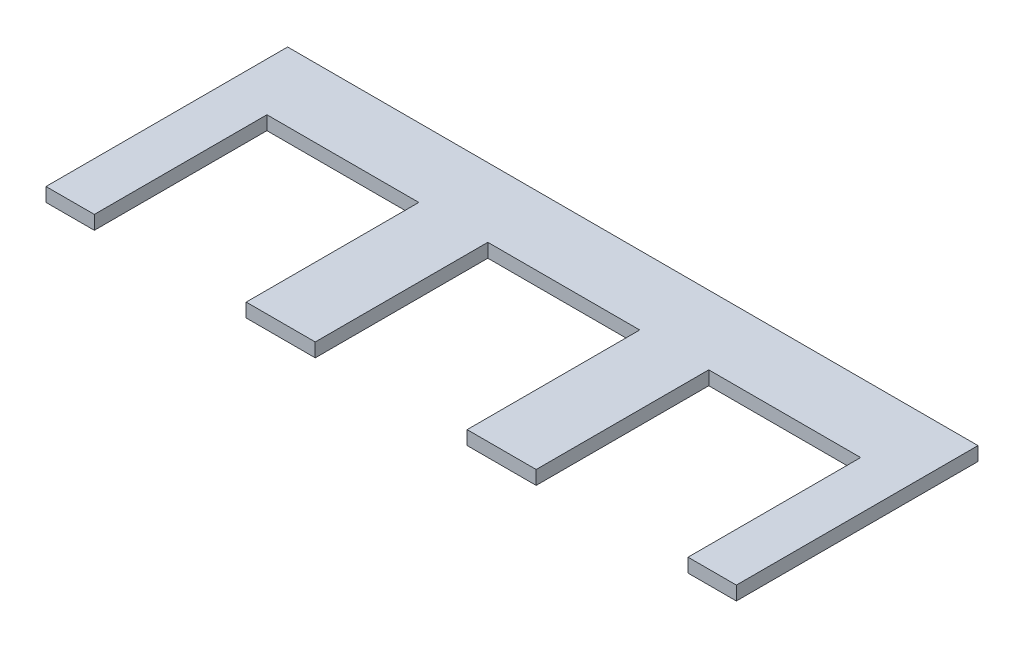
ISO-10303-21;
HEADER;
FILE_DESCRIPTION(('STEP AP214'),'2;1');
FILE_NAME('part.step','',(''),(''),'','','');
FILE_SCHEMA(('AUTOMOTIVE_DESIGN { 1 0 10303 214 1 1 1 1 }'));
ENDSEC;
DATA;
#1=APPLICATION_CONTEXT('core data for automotive mechanical design processes');
#2=APPLICATION_PROTOCOL_DEFINITION('international standard','automotive_design',2000,#1);
#3=PRODUCT_CONTEXT('',#1,'mechanical');
#4=PRODUCT('Part','Part','',(#3));
#5=PRODUCT_RELATED_PRODUCT_CATEGORY('part','',(#4));
#6=PRODUCT_DEFINITION_FORMATION('','',#4);
#7=PRODUCT_DEFINITION_CONTEXT('part definition',#1,'design');
#8=PRODUCT_DEFINITION('design','',#6,#7);
#9=PRODUCT_DEFINITION_SHAPE('','',#8);
#10=(LENGTH_UNIT() NAMED_UNIT(*) SI_UNIT(.MILLI.,.METRE.));
#11=(NAMED_UNIT(*) PLANE_ANGLE_UNIT() SI_UNIT($,.RADIAN.));
#12=(NAMED_UNIT(*) SI_UNIT($,.STERADIAN.) SOLID_ANGLE_UNIT());
#13=UNCERTAINTY_MEASURE_WITH_UNIT(LENGTH_MEASURE(1.E-05),#10,'distance_accuracy_value','');
#14=(GEOMETRIC_REPRESENTATION_CONTEXT(3) GLOBAL_UNCERTAINTY_ASSIGNED_CONTEXT((#13)) GLOBAL_UNIT_ASSIGNED_CONTEXT((#10,
#11,#12)) REPRESENTATION_CONTEXT('',''));
#15=CARTESIAN_POINT('',(0.,0.,0.));
#16=DIRECTION('',(0.,0.,1.));
#17=DIRECTION('',(1.,0.,0.));
#18=AXIS2_PLACEMENT_3D('',#15,#16,#17);
#19=CARTESIAN_POINT('',(-500.,20.,175.));
#20=DIRECTION('',(0.,0.,-1.));
#21=DIRECTION('',(-1.,0.,0.));
#22=AXIS2_PLACEMENT_3D('',#19,#20,#21);
#23=PLANE('',#22);
#24=DIRECTION('',(1.,0.,0.));
#25=VECTOR('',#24,1.);
#26=CARTESIAN_POINT('',(-500.,0.,175.));
#27=LINE('',#26,#25);
#28=CARTESIAN_POINT('',(110.,0.,175.));
#29=VERTEX_POINT('',#28);
#30=CARTESIAN_POINT('',(210.,0.,175.));
#31=VERTEX_POINT('',#30);
#32=EDGE_CURVE('E189',#29,#31,#27,.T.);
#33=ORIENTED_EDGE('',*,*,#32,.T.);
#34=DIRECTION('',(0.,1.,0.));
#35=VECTOR('',#34,1.);
#36=CARTESIAN_POINT('',(210.,0.,175.));
#37=LINE('',#36,#35);
#38=CARTESIAN_POINT('',(210.,20.,175.));
#39=VERTEX_POINT('',#38);
#40=EDGE_CURVE('E246',#31,#39,#37,.T.);
#41=ORIENTED_EDGE('',*,*,#40,.T.);
#42=DIRECTION('',(1.,0.,0.));
#43=VECTOR('',#42,1.);
#44=CARTESIAN_POINT('',(-500.,20.,175.));
#45=LINE('',#44,#43);
#46=CARTESIAN_POINT('',(110.,20.,175.));
#47=VERTEX_POINT('',#46);
#48=EDGE_CURVE('E283',#47,#39,#45,.T.);
#49=ORIENTED_EDGE('',*,*,#48,.F.);
#50=DIRECTION('',(0.,1.,0.));
#51=VECTOR('',#50,1.);
#52=CARTESIAN_POINT('',(110.,0.,175.));
#53=LINE('',#52,#51);
#54=EDGE_CURVE('E216',#29,#47,#53,.T.);
#55=ORIENTED_EDGE('',*,*,#54,.F.);
#56=EDGE_LOOP('',(#33,#41,#49,#55));
#57=FACE_BOUND('',#56,.T.);
#58=ADVANCED_FACE('F39',(#57),#23,.F.);
#59=CARTESIAN_POINT('',(-500.,0.,175.));
#60=VERTEX_POINT('',#59);
#61=CARTESIAN_POINT('',(-430.,0.,175.));
#62=VERTEX_POINT('',#61);
#63=EDGE_CURVE('E166',#60,#62,#27,.T.);
#64=ORIENTED_EDGE('',*,*,#63,.T.);
#65=DIRECTION('',(0.,1.,0.));
#66=VECTOR('',#65,1.);
#67=CARTESIAN_POINT('',(-430.,0.,175.));
#68=LINE('',#67,#66);
#69=CARTESIAN_POINT('',(-430.,20.,175.));
#70=VERTEX_POINT('',#69);
#71=EDGE_CURVE('E155',#62,#70,#68,.T.);
#72=ORIENTED_EDGE('',*,*,#71,.T.);
#73=CARTESIAN_POINT('',(-500.,20.,175.));
#74=VERTEX_POINT('',#73);
#75=EDGE_CURVE('E202',#74,#70,#45,.T.);
#76=ORIENTED_EDGE('',*,*,#75,.F.);
#77=DIRECTION('',(0.,-1.,0.));
#78=VECTOR('',#77,1.);
#79=CARTESIAN_POINT('',(-500.,20.,175.));
#80=LINE('',#79,#78);
#81=EDGE_CURVE('E180',#74,#60,#80,.T.);
#82=ORIENTED_EDGE('',*,*,#81,.T.);
#83=EDGE_LOOP('',(#64,#72,#76,#82));
#84=FACE_BOUND('',#83,.T.);
#85=ADVANCED_FACE('F172',(#84),#23,.F.);
#86=CARTESIAN_POINT('',(-210.,20.,175.));
#87=VERTEX_POINT('',#86);
#88=CARTESIAN_POINT('',(-110.,20.,175.));
#89=VERTEX_POINT('',#88);
#90=EDGE_CURVE('E208',#87,#89,#45,.T.);
#91=ORIENTED_EDGE('',*,*,#90,.F.);
#92=DIRECTION('',(0.,1.,0.));
#93=VECTOR('',#92,1.);
#94=CARTESIAN_POINT('',(-210.,0.,175.));
#95=LINE('',#94,#93);
#96=CARTESIAN_POINT('',(-210.,0.,175.));
#97=VERTEX_POINT('',#96);
#98=EDGE_CURVE('E165',#97,#87,#95,.T.);
#99=ORIENTED_EDGE('',*,*,#98,.F.);
#100=CARTESIAN_POINT('',(-110.,0.,175.));
#101=VERTEX_POINT('',#100);
#102=EDGE_CURVE('E177',#97,#101,#27,.T.);
#103=ORIENTED_EDGE('',*,*,#102,.T.);
#104=DIRECTION('',(0.,1.,0.));
#105=VECTOR('',#104,1.);
#106=CARTESIAN_POINT('',(-110.,0.,175.));
#107=LINE('',#106,#105);
#108=EDGE_CURVE('E213',#101,#89,#107,.T.);
#109=ORIENTED_EDGE('',*,*,#108,.T.);
#110=EDGE_LOOP('',(#91,#99,#103,#109));
#111=FACE_BOUND('',#110,.T.);
#112=ADVANCED_FACE('F278',(#111),#23,.F.);
#113=CARTESIAN_POINT('',(500.,20.,175.));
#114=DIRECTION('',(-1.,0.,0.));
#115=DIRECTION('',(0.,0.,1.));
#116=AXIS2_PLACEMENT_3D('',#113,#114,#115);
#117=PLANE('',#116);
#118=DIRECTION('',(0.,0.,-1.));
#119=VECTOR('',#118,1.);
#120=CARTESIAN_POINT('',(500.,0.,175.));
#121=LINE('',#120,#119);
#122=CARTESIAN_POINT('',(500.,0.,175.));
#123=VERTEX_POINT('',#122);
#124=CARTESIAN_POINT('',(500.,0.,-175.));
#125=VERTEX_POINT('',#124);
#126=EDGE_CURVE('E200',#123,#125,#121,.T.);
#127=ORIENTED_EDGE('',*,*,#126,.T.);
#128=DIRECTION('',(0.,-1.,0.));
#129=VECTOR('',#128,1.);
#130=CARTESIAN_POINT('',(500.,20.,-175.));
#131=LINE('',#130,#129);
#132=CARTESIAN_POINT('',(500.,20.,-175.));
#133=VERTEX_POINT('',#132);
#134=EDGE_CURVE('E11',#133,#125,#131,.T.);
#135=ORIENTED_EDGE('',*,*,#134,.F.);
#136=DIRECTION('',(0.,0.,-1.));
#137=VECTOR('',#136,1.);
#138=CARTESIAN_POINT('',(500.,20.,175.));
#139=LINE('',#138,#137);
#140=CARTESIAN_POINT('',(500.,20.,175.));
#141=VERTEX_POINT('',#140);
#142=EDGE_CURVE('E178',#141,#133,#139,.T.);
#143=ORIENTED_EDGE('',*,*,#142,.F.);
#144=DIRECTION('',(0.,-1.,0.));
#145=VECTOR('',#144,1.);
#146=CARTESIAN_POINT('',(500.,20.,175.));
#147=LINE('',#146,#145);
#148=EDGE_CURVE('E210',#141,#123,#147,.T.);
#149=ORIENTED_EDGE('',*,*,#148,.T.);
#150=EDGE_LOOP('',(#127,#135,#143,#149));
#151=FACE_BOUND('',#150,.T.);
#152=ADVANCED_FACE('F41',(#151),#117,.F.);
#153=CARTESIAN_POINT('',(-500.,20.,-175.));
#154=DIRECTION('',(0.,0.,1.));
#155=DIRECTION('',(1.,0.,0.));
#156=AXIS2_PLACEMENT_3D('',#153,#154,#155);
#157=PLANE('',#156);
#158=DIRECTION('',(-1.,0.,0.));
#159=VECTOR('',#158,1.);
#160=CARTESIAN_POINT('',(-500.,0.,-175.));
#161=LINE('',#160,#159);
#162=CARTESIAN_POINT('',(-500.,0.,-175.));
#163=VERTEX_POINT('',#162);
#164=EDGE_CURVE('E198',#125,#163,#161,.T.);
#165=ORIENTED_EDGE('',*,*,#164,.T.);
#166=DIRECTION('',(0.,-1.,0.));
#167=VECTOR('',#166,1.);
#168=CARTESIAN_POINT('',(-500.,20.,-175.));
#169=LINE('',#168,#167);
#170=CARTESIAN_POINT('',(-500.,20.,-175.));
#171=VERTEX_POINT('',#170);
#172=EDGE_CURVE('E50',#171,#163,#169,.T.);
#173=ORIENTED_EDGE('',*,*,#172,.F.);
#174=DIRECTION('',(-1.,0.,0.));
#175=VECTOR('',#174,1.);
#176=CARTESIAN_POINT('',(-500.,20.,-175.));
#177=LINE('',#176,#175);
#178=EDGE_CURVE('E181',#133,#171,#177,.T.);
#179=ORIENTED_EDGE('',*,*,#178,.F.);
#180=ORIENTED_EDGE('',*,*,#134,.T.);
#181=EDGE_LOOP('',(#165,#173,#179,#180));
#182=FACE_BOUND('',#181,.T.);
#183=ADVANCED_FACE('F298',(#182),#157,.F.);
#184=CARTESIAN_POINT('',(-500.,20.,175.));
#185=DIRECTION('',(1.,0.,0.));
#186=DIRECTION('',(0.,0.,-1.));
#187=AXIS2_PLACEMENT_3D('',#184,#185,#186);
#188=PLANE('',#187);
#189=DIRECTION('',(0.,0.,1.));
#190=VECTOR('',#189,1.);
#191=CARTESIAN_POINT('',(-500.,0.,175.));
#192=LINE('',#191,#190);
#193=EDGE_CURVE('E188',#163,#60,#192,.T.);
#194=ORIENTED_EDGE('',*,*,#193,.T.);
#195=ORIENTED_EDGE('',*,*,#81,.F.);
#196=DIRECTION('',(0.,0.,1.));
#197=VECTOR('',#196,1.);
#198=CARTESIAN_POINT('',(-500.,20.,175.));
#199=LINE('',#198,#197);
#200=EDGE_CURVE('E209',#171,#74,#199,.T.);
#201=ORIENTED_EDGE('',*,*,#200,.F.);
#202=ORIENTED_EDGE('',*,*,#172,.T.);
#203=EDGE_LOOP('',(#194,#195,#201,#202));
#204=FACE_BOUND('',#203,.T.);
#205=ADVANCED_FACE('F305',(#204),#188,.F.);
#206=CARTESIAN_POINT('',(430.,20.,175.));
#207=VERTEX_POINT('',#206);
#208=EDGE_CURVE('E207',#207,#141,#45,.T.);
#209=ORIENTED_EDGE('',*,*,#208,.F.);
#210=DIRECTION('',(0.,1.,0.));
#211=VECTOR('',#210,1.);
#212=CARTESIAN_POINT('',(430.,0.,175.));
#213=LINE('',#212,#211);
#214=CARTESIAN_POINT('',(430.,0.,175.));
#215=VERTEX_POINT('',#214);
#216=EDGE_CURVE('E239',#215,#207,#213,.T.);
#217=ORIENTED_EDGE('',*,*,#216,.F.);
#218=EDGE_CURVE('E182',#215,#123,#27,.T.);
#219=ORIENTED_EDGE('',*,*,#218,.T.);
#220=ORIENTED_EDGE('',*,*,#148,.F.);
#221=EDGE_LOOP('',(#209,#217,#219,#220));
#222=FACE_BOUND('',#221,.T.);
#223=ADVANCED_FACE('F293',(#222),#23,.F.);
#224=CARTESIAN_POINT('',(0.,20.,0.));
#225=DIRECTION('',(0.,-1.,0.));
#226=DIRECTION('',(0.,0.,-1.));
#227=AXIS2_PLACEMENT_3D('',#224,#225,#226);
#228=PLANE('',#227);
#229=ORIENTED_EDGE('',*,*,#48,.T.);
#230=DIRECTION('',(0.,0.,1.));
#231=VECTOR('',#230,1.);
#232=CARTESIAN_POINT('',(210.,20.,175.));
#233=LINE('',#232,#231);
#234=CARTESIAN_POINT('',(210.,20.,-75.));
#235=VERTEX_POINT('',#234);
#236=EDGE_CURVE('E247',#235,#39,#233,.T.);
#237=ORIENTED_EDGE('',*,*,#236,.F.);
#238=DIRECTION('',(-1.,0.,0.));
#239=VECTOR('',#238,1.);
#240=CARTESIAN_POINT('',(430.,20.,-75.0000000000001));
#241=LINE('',#240,#239);
#242=CARTESIAN_POINT('',(430.,20.,-75.0000000000001));
#243=VERTEX_POINT('',#242);
#244=EDGE_CURVE('E252',#243,#235,#241,.T.);
#245=ORIENTED_EDGE('',*,*,#244,.F.);
#246=DIRECTION('',(0.,0.,-1.));
#247=VECTOR('',#246,1.);
#248=CARTESIAN_POINT('',(430.,20.,175.));
#249=LINE('',#248,#247);
#250=EDGE_CURVE('E254',#207,#243,#249,.T.);
#251=ORIENTED_EDGE('',*,*,#250,.F.);
#252=ORIENTED_EDGE('',*,*,#208,.T.);
#253=ORIENTED_EDGE('',*,*,#142,.T.);
#254=ORIENTED_EDGE('',*,*,#178,.T.);
#255=ORIENTED_EDGE('',*,*,#200,.T.);
#256=ORIENTED_EDGE('',*,*,#75,.T.);
#257=DIRECTION('',(0.,0.,1.));
#258=VECTOR('',#257,1.);
#259=CARTESIAN_POINT('',(-430.,20.,175.));
#260=LINE('',#259,#258);
#261=CARTESIAN_POINT('',(-430.,20.,-75.));
#262=VERTEX_POINT('',#261);
#263=EDGE_CURVE('E160',#262,#70,#260,.T.);
#264=ORIENTED_EDGE('',*,*,#263,.F.);
#265=DIRECTION('',(-1.,0.,0.));
#266=VECTOR('',#265,1.);
#267=CARTESIAN_POINT('',(-430.,20.,-75.));
#268=LINE('',#267,#266);
#269=CARTESIAN_POINT('',(-210.,20.,-75.));
#270=VERTEX_POINT('',#269);
#271=EDGE_CURVE('E171',#270,#262,#268,.T.);
#272=ORIENTED_EDGE('',*,*,#271,.F.);
#273=DIRECTION('',(0.,0.,-1.));
#274=VECTOR('',#273,1.);
#275=CARTESIAN_POINT('',(-210.,20.,175.));
#276=LINE('',#275,#274);
#277=EDGE_CURVE('E268',#87,#270,#276,.T.);
#278=ORIENTED_EDGE('',*,*,#277,.F.);
#279=ORIENTED_EDGE('',*,*,#90,.T.);
#280=DIRECTION('',(0.,0.,1.));
#281=VECTOR('',#280,1.);
#282=CARTESIAN_POINT('',(-110.,20.,175.));
#283=LINE('',#282,#281);
#284=CARTESIAN_POINT('',(-110.,20.,-74.9999999999999));
#285=VERTEX_POINT('',#284);
#286=EDGE_CURVE('E228',#285,#89,#283,.T.);
#287=ORIENTED_EDGE('',*,*,#286,.F.);
#288=DIRECTION('',(-1.,0.,0.));
#289=VECTOR('',#288,1.);
#290=CARTESIAN_POINT('',(-110.,20.,-74.9999999999999));
#291=LINE('',#290,#289);
#292=CARTESIAN_POINT('',(110.,20.,-75.));
#293=VERTEX_POINT('',#292);
#294=EDGE_CURVE('E225',#293,#285,#291,.T.);
#295=ORIENTED_EDGE('',*,*,#294,.F.);
#296=DIRECTION('',(0.,0.,-1.));
#297=VECTOR('',#296,1.);
#298=CARTESIAN_POINT('',(110.,20.,175.));
#299=LINE('',#298,#297);
#300=EDGE_CURVE('E229',#47,#293,#299,.T.);
#301=ORIENTED_EDGE('',*,*,#300,.F.);
#302=EDGE_LOOP('',(#229,#237,#245,#251,#252,#253,#254,#255,#256,#264,#272,#278,#279,#287,#295,#301));
#303=FACE_BOUND('',#302,.T.);
#304=ADVANCED_FACE('F292',(#303),#228,.F.);
#305=CARTESIAN_POINT('',(0.,0.,0.));
#306=DIRECTION('',(0.,-1.,0.));
#307=DIRECTION('',(0.,0.,-1.));
#308=AXIS2_PLACEMENT_3D('',#305,#306,#307);
#309=PLANE('',#308);
#310=DIRECTION('',(0.,0.,1.));
#311=VECTOR('',#310,1.);
#312=CARTESIAN_POINT('',(210.,0.,175.));
#313=LINE('',#312,#311);
#314=CARTESIAN_POINT('',(210.,0.,-75.));
#315=VERTEX_POINT('',#314);
#316=EDGE_CURVE('E241',#315,#31,#313,.T.);
#317=ORIENTED_EDGE('',*,*,#316,.T.);
#318=ORIENTED_EDGE('',*,*,#32,.F.);
#319=DIRECTION('',(0.,0.,-1.));
#320=VECTOR('',#319,1.);
#321=CARTESIAN_POINT('',(110.,0.,175.));
#322=LINE('',#321,#320);
#323=CARTESIAN_POINT('',(110.,0.,-75.));
#324=VERTEX_POINT('',#323);
#325=EDGE_CURVE('E232',#29,#324,#322,.T.);
#326=ORIENTED_EDGE('',*,*,#325,.T.);
#327=DIRECTION('',(-1.,0.,0.));
#328=VECTOR('',#327,1.);
#329=CARTESIAN_POINT('',(-110.,0.,-74.9999999999999));
#330=LINE('',#329,#328);
#331=CARTESIAN_POINT('',(-110.,0.,-74.9999999999999));
#332=VERTEX_POINT('',#331);
#333=EDGE_CURVE('E220',#324,#332,#330,.T.);
#334=ORIENTED_EDGE('',*,*,#333,.T.);
#335=DIRECTION('',(0.,0.,1.));
#336=VECTOR('',#335,1.);
#337=CARTESIAN_POINT('',(-110.,0.,175.));
#338=LINE('',#337,#336);
#339=EDGE_CURVE('E223',#332,#101,#338,.T.);
#340=ORIENTED_EDGE('',*,*,#339,.T.);
#341=ORIENTED_EDGE('',*,*,#102,.F.);
#342=DIRECTION('',(0.,0.,-1.));
#343=VECTOR('',#342,1.);
#344=CARTESIAN_POINT('',(-210.,0.,175.));
#345=LINE('',#344,#343);
#346=CARTESIAN_POINT('',(-210.,0.,-75.));
#347=VERTEX_POINT('',#346);
#348=EDGE_CURVE('E174',#97,#347,#345,.T.);
#349=ORIENTED_EDGE('',*,*,#348,.T.);
#350=DIRECTION('',(-1.,0.,0.));
#351=VECTOR('',#350,1.);
#352=CARTESIAN_POINT('',(-430.,0.,-75.));
#353=LINE('',#352,#351);
#354=CARTESIAN_POINT('',(-430.,0.,-75.));
#355=VERTEX_POINT('',#354);
#356=EDGE_CURVE('E61',#347,#355,#353,.T.);
#357=ORIENTED_EDGE('',*,*,#356,.T.);
#358=DIRECTION('',(0.,0.,1.));
#359=VECTOR('',#358,1.);
#360=CARTESIAN_POINT('',(-430.,0.,175.));
#361=LINE('',#360,#359);
#362=EDGE_CURVE('E154',#355,#62,#361,.T.);
#363=ORIENTED_EDGE('',*,*,#362,.T.);
#364=ORIENTED_EDGE('',*,*,#63,.F.);
#365=ORIENTED_EDGE('',*,*,#193,.F.);
#366=ORIENTED_EDGE('',*,*,#164,.F.);
#367=ORIENTED_EDGE('',*,*,#126,.F.);
#368=ORIENTED_EDGE('',*,*,#218,.F.);
#369=DIRECTION('',(0.,0.,-1.));
#370=VECTOR('',#369,1.);
#371=CARTESIAN_POINT('',(430.,0.,175.));
#372=LINE('',#371,#370);
#373=CARTESIAN_POINT('',(430.,0.,-75.0000000000001));
#374=VERTEX_POINT('',#373);
#375=EDGE_CURVE('E253',#215,#374,#372,.T.);
#376=ORIENTED_EDGE('',*,*,#375,.T.);
#377=DIRECTION('',(-1.,0.,0.));
#378=VECTOR('',#377,1.);
#379=CARTESIAN_POINT('',(430.,0.,-75.0000000000001));
#380=LINE('',#379,#378);
#381=EDGE_CURVE('E53',#374,#315,#380,.T.);
#382=ORIENTED_EDGE('',*,*,#381,.T.);
#383=EDGE_LOOP('',(#317,#318,#326,#334,#340,#341,#349,#357,#363,#364,#365,#366,#367,#368,#376,#382));
#384=FACE_BOUND('',#383,.T.);
#385=ADVANCED_FACE('F170',(#384),#309,.T.);
#386=CARTESIAN_POINT('',(-110.,0.,175.));
#387=DIRECTION('',(-1.,0.,0.));
#388=DIRECTION('',(0.,0.,1.));
#389=AXIS2_PLACEMENT_3D('',#386,#387,#388);
#390=PLANE('',#389);
#391=ORIENTED_EDGE('',*,*,#286,.T.);
#392=ORIENTED_EDGE('',*,*,#108,.F.);
#393=ORIENTED_EDGE('',*,*,#339,.F.);
#394=DIRECTION('',(0.,1.,0.));
#395=VECTOR('',#394,1.);
#396=CARTESIAN_POINT('',(-110.,0.,-74.9999999999999));
#397=LINE('',#396,#395);
#398=EDGE_CURVE('E204',#332,#285,#397,.T.);
#399=ORIENTED_EDGE('',*,*,#398,.T.);
#400=EDGE_LOOP('',(#391,#392,#393,#399));
#401=FACE_BOUND('',#400,.T.);
#402=ADVANCED_FACE('F321',(#401),#390,.F.);
#403=CARTESIAN_POINT('',(-110.,0.,-74.9999999999999));
#404=DIRECTION('',(0.,0.,-1.));
#405=DIRECTION('',(-1.,0.,0.));
#406=AXIS2_PLACEMENT_3D('',#403,#404,#405);
#407=PLANE('',#406);
#408=ORIENTED_EDGE('',*,*,#294,.T.);
#409=ORIENTED_EDGE('',*,*,#398,.F.);
#410=ORIENTED_EDGE('',*,*,#333,.F.);
#411=DIRECTION('',(0.,1.,0.));
#412=VECTOR('',#411,1.);
#413=CARTESIAN_POINT('',(110.,0.,-75.));
#414=LINE('',#413,#412);
#415=EDGE_CURVE('E218',#324,#293,#414,.T.);
#416=ORIENTED_EDGE('',*,*,#415,.T.);
#417=EDGE_LOOP('',(#408,#409,#410,#416));
#418=FACE_BOUND('',#417,.T.);
#419=ADVANCED_FACE('F318',(#418),#407,.F.);
#420=CARTESIAN_POINT('',(110.,0.,175.));
#421=DIRECTION('',(1.,0.,0.));
#422=DIRECTION('',(0.,0.,-1.));
#423=AXIS2_PLACEMENT_3D('',#420,#421,#422);
#424=PLANE('',#423);
#425=ORIENTED_EDGE('',*,*,#300,.T.);
#426=ORIENTED_EDGE('',*,*,#415,.F.);
#427=ORIENTED_EDGE('',*,*,#325,.F.);
#428=ORIENTED_EDGE('',*,*,#54,.T.);
#429=EDGE_LOOP('',(#425,#426,#427,#428));
#430=FACE_BOUND('',#429,.T.);
#431=ADVANCED_FACE('F312',(#430),#424,.F.);
#432=CARTESIAN_POINT('',(-430.,0.,175.));
#433=DIRECTION('',(-1.,0.,0.));
#434=DIRECTION('',(0.,0.,1.));
#435=AXIS2_PLACEMENT_3D('',#432,#433,#434);
#436=PLANE('',#435);
#437=ORIENTED_EDGE('',*,*,#263,.T.);
#438=ORIENTED_EDGE('',*,*,#71,.F.);
#439=ORIENTED_EDGE('',*,*,#362,.F.);
#440=DIRECTION('',(0.,1.,0.));
#441=VECTOR('',#440,1.);
#442=CARTESIAN_POINT('',(-430.,0.,-75.));
#443=LINE('',#442,#441);
#444=EDGE_CURVE('E231',#355,#262,#443,.T.);
#445=ORIENTED_EDGE('',*,*,#444,.T.);
#446=EDGE_LOOP('',(#437,#438,#439,#445));
#447=FACE_BOUND('',#446,.T.);
#448=ADVANCED_FACE('F152',(#447),#436,.F.);
#449=CARTESIAN_POINT('',(-430.,0.,-75.));
#450=DIRECTION('',(0.,0.,-1.));
#451=DIRECTION('',(-1.,0.,0.));
#452=AXIS2_PLACEMENT_3D('',#449,#450,#451);
#453=PLANE('',#452);
#454=ORIENTED_EDGE('',*,*,#271,.T.);
#455=ORIENTED_EDGE('',*,*,#444,.F.);
#456=ORIENTED_EDGE('',*,*,#356,.F.);
#457=DIRECTION('',(0.,1.,0.));
#458=VECTOR('',#457,1.);
#459=CARTESIAN_POINT('',(-210.,0.,-75.));
#460=LINE('',#459,#458);
#461=EDGE_CURVE('E263',#347,#270,#460,.T.);
#462=ORIENTED_EDGE('',*,*,#461,.T.);
#463=EDGE_LOOP('',(#454,#455,#456,#462));
#464=FACE_BOUND('',#463,.T.);
#465=ADVANCED_FACE('F391',(#464),#453,.F.);
#466=CARTESIAN_POINT('',(-210.,0.,175.));
#467=DIRECTION('',(1.,0.,0.));
#468=DIRECTION('',(0.,0.,-1.));
#469=AXIS2_PLACEMENT_3D('',#466,#467,#468);
#470=PLANE('',#469);
#471=ORIENTED_EDGE('',*,*,#277,.T.);
#472=ORIENTED_EDGE('',*,*,#461,.F.);
#473=ORIENTED_EDGE('',*,*,#348,.F.);
#474=ORIENTED_EDGE('',*,*,#98,.T.);
#475=EDGE_LOOP('',(#471,#472,#473,#474));
#476=FACE_BOUND('',#475,.T.);
#477=ADVANCED_FACE('F277',(#476),#470,.F.);
#478=CARTESIAN_POINT('',(210.,0.,175.));
#479=DIRECTION('',(-1.,0.,0.));
#480=DIRECTION('',(0.,0.,1.));
#481=AXIS2_PLACEMENT_3D('',#478,#479,#480);
#482=PLANE('',#481);
#483=ORIENTED_EDGE('',*,*,#236,.T.);
#484=ORIENTED_EDGE('',*,*,#40,.F.);
#485=ORIENTED_EDGE('',*,*,#316,.F.);
#486=DIRECTION('',(0.,1.,0.));
#487=VECTOR('',#486,1.);
#488=CARTESIAN_POINT('',(210.,0.,-75.));
#489=LINE('',#488,#487);
#490=EDGE_CURVE('E243',#315,#235,#489,.T.);
#491=ORIENTED_EDGE('',*,*,#490,.T.);
#492=EDGE_LOOP('',(#483,#484,#485,#491));
#493=FACE_BOUND('',#492,.T.);
#494=ADVANCED_FACE('F310',(#493),#482,.F.);
#495=CARTESIAN_POINT('',(430.,0.,-75.0000000000001));
#496=DIRECTION('',(0.,0.,-1.));
#497=DIRECTION('',(-1.,0.,0.));
#498=AXIS2_PLACEMENT_3D('',#495,#496,#497);
#499=PLANE('',#498);
#500=ORIENTED_EDGE('',*,*,#244,.T.);
#501=ORIENTED_EDGE('',*,*,#490,.F.);
#502=ORIENTED_EDGE('',*,*,#381,.F.);
#503=DIRECTION('',(0.,1.,0.));
#504=VECTOR('',#503,1.);
#505=CARTESIAN_POINT('',(430.,0.,-75.0000000000001));
#506=LINE('',#505,#504);
#507=EDGE_CURVE('E244',#374,#243,#506,.T.);
#508=ORIENTED_EDGE('',*,*,#507,.T.);
#509=EDGE_LOOP('',(#500,#501,#502,#508));
#510=FACE_BOUND('',#509,.T.);
#511=ADVANCED_FACE('F308',(#510),#499,.F.);
#512=CARTESIAN_POINT('',(430.,0.,175.));
#513=DIRECTION('',(1.,0.,0.));
#514=DIRECTION('',(0.,0.,-1.));
#515=AXIS2_PLACEMENT_3D('',#512,#513,#514);
#516=PLANE('',#515);
#517=ORIENTED_EDGE('',*,*,#250,.T.);
#518=ORIENTED_EDGE('',*,*,#507,.F.);
#519=ORIENTED_EDGE('',*,*,#375,.F.);
#520=ORIENTED_EDGE('',*,*,#216,.T.);
#521=EDGE_LOOP('',(#517,#518,#519,#520));
#522=FACE_BOUND('',#521,.T.);
#523=ADVANCED_FACE('F304',(#522),#516,.F.);
#524=CLOSED_SHELL('',(#58,#85,#112,#152,#183,#205,#223,#304,#385,#402,#419,#431,#448,#465,#477,
#494,#511,#523));
#525=MANIFOLD_SOLID_BREP('B2',#524);
#526=ADVANCED_BREP_SHAPE_REPRESENTATION('',(#18,#525),#14);
#527=SHAPE_DEFINITION_REPRESENTATION(#9,#526);
ENDSEC;
END-ISO-10303-21;
